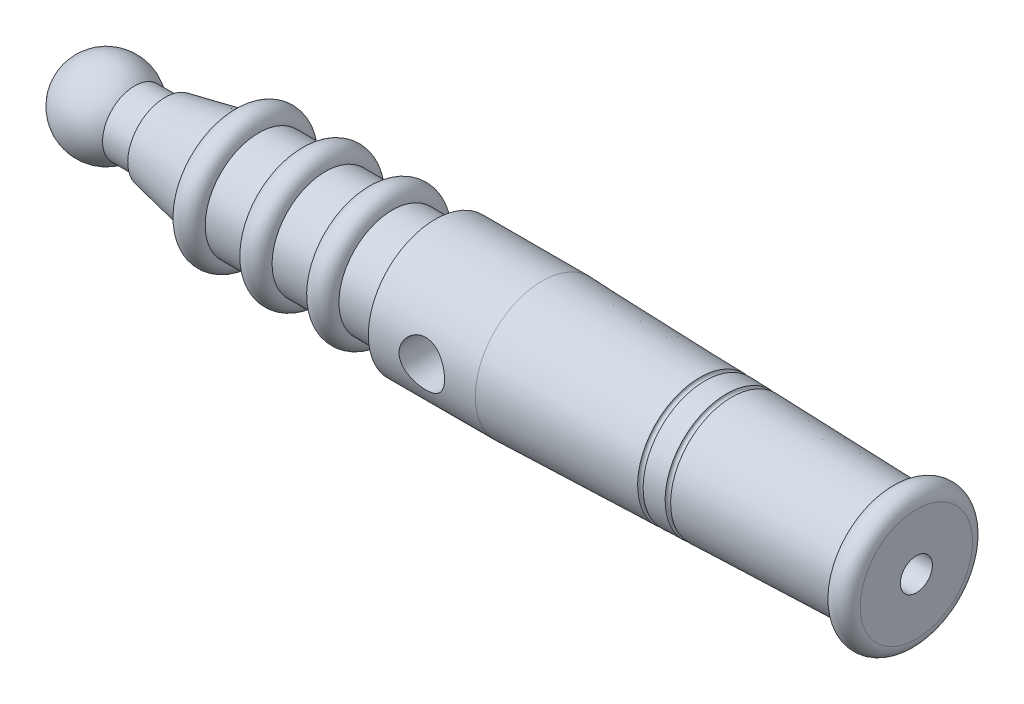
ISO-10303-21;
HEADER;
FILE_DESCRIPTION(('STEP AP214'),'2;1');
FILE_NAME('part.step','',(''),(''),'','','');
FILE_SCHEMA(('AUTOMOTIVE_DESIGN { 1 0 10303 214 1 1 1 1 }'));
ENDSEC;
DATA;
#1=APPLICATION_CONTEXT('core data for automotive mechanical design processes');
#2=APPLICATION_PROTOCOL_DEFINITION('international standard','automotive_design',2000,#1);
#3=PRODUCT_CONTEXT('',#1,'mechanical');
#4=PRODUCT('Part','Part','',(#3));
#5=PRODUCT_RELATED_PRODUCT_CATEGORY('part','',(#4));
#6=PRODUCT_DEFINITION_FORMATION('','',#4);
#7=PRODUCT_DEFINITION_CONTEXT('part definition',#1,'design');
#8=PRODUCT_DEFINITION('design','',#6,#7);
#9=PRODUCT_DEFINITION_SHAPE('','',#8);
#10=(LENGTH_UNIT() NAMED_UNIT(*) SI_UNIT(.MILLI.,.METRE.));
#11=(NAMED_UNIT(*) PLANE_ANGLE_UNIT() SI_UNIT($,.RADIAN.));
#12=(NAMED_UNIT(*) SI_UNIT($,.STERADIAN.) SOLID_ANGLE_UNIT());
#13=UNCERTAINTY_MEASURE_WITH_UNIT(LENGTH_MEASURE(1.E-05),#10,'distance_accuracy_value','');
#14=(GEOMETRIC_REPRESENTATION_CONTEXT(3) GLOBAL_UNCERTAINTY_ASSIGNED_CONTEXT((#13)) GLOBAL_UNIT_ASSIGNED_CONTEXT((#10,
#11,#12)) REPRESENTATION_CONTEXT('',''));
#15=CARTESIAN_POINT('',(0.,0.,0.));
#16=DIRECTION('',(0.,0.,1.));
#17=DIRECTION('',(1.,0.,0.));
#18=AXIS2_PLACEMENT_3D('',#15,#16,#17);
#19=CARTESIAN_POINT('',(8.,0.,0.));
#20=DIRECTION('',(-1.,0.,0.));
#21=DIRECTION('',(0.,1.,0.));
#22=AXIS2_PLACEMENT_3D('',#19,#20,#21);
#23=SPHERICAL_SURFACE('',#22,8.);
#24=CARTESIAN_POINT('',(13.2915026221292,0.,0.));
#25=DIRECTION('',(-1.,0.,0.));
#26=DIRECTION('',(0.,-1.,0.));
#27=AXIS2_PLACEMENT_3D('',#24,#25,#26);
#28=CIRCLE('',#27,6.);
#29=CARTESIAN_POINT('',(13.2915026221292,-6.,0.));
#30=VERTEX_POINT('',#29);
#31=EDGE_CURVE('E10',#30,#30,#28,.T.);
#32=ORIENTED_EDGE('',*,*,#31,.T.);
#33=EDGE_LOOP('',(#32));
#34=FACE_BOUND('',#33,.T.);
#35=ADVANCED_FACE('F35',(#34),#23,.T.);
#36=CARTESIAN_POINT('',(0.,0.,0.));
#37=DIRECTION('',(-1.,0.,0.));
#38=DIRECTION('',(0.,-1.,0.));
#39=AXIS2_PLACEMENT_3D('',#36,#37,#38);
#40=CYLINDRICAL_SURFACE('',#39,6.);
#41=ORIENTED_EDGE('',*,*,#31,.F.);
#42=EDGE_LOOP('',(#41));
#43=FACE_BOUND('',#42,.T.);
#44=CARTESIAN_POINT('',(19.,0.,0.));
#45=DIRECTION('',(-1.,0.,0.));
#46=DIRECTION('',(0.,-1.,0.));
#47=AXIS2_PLACEMENT_3D('',#44,#45,#46);
#48=CIRCLE('',#47,6.);
#49=CARTESIAN_POINT('',(19.,-6.,0.));
#50=VERTEX_POINT('',#49);
#51=EDGE_CURVE('E47',#50,#50,#48,.T.);
#52=ORIENTED_EDGE('',*,*,#51,.T.);
#53=EDGE_LOOP('',(#52));
#54=FACE_BOUND('',#53,.T.);
#55=ADVANCED_FACE('F112',(#43,#54),#40,.T.);
#56=CARTESIAN_POINT('',(19.,7.,0.));
#57=DIRECTION('',(1.,0.,0.));
#58=DIRECTION('',(0.,1.,0.));
#59=AXIS2_PLACEMENT_3D('',#56,#57,#58);
#60=PLANE('',#59);
#61=ORIENTED_EDGE('',*,*,#51,.F.);
#62=EDGE_LOOP('',(#61));
#63=FACE_BOUND('',#62,.T.);
#64=CARTESIAN_POINT('',(19.,0.,0.));
#65=DIRECTION('',(-1.,0.,0.));
#66=DIRECTION('',(0.,-1.,0.));
#67=AXIS2_PLACEMENT_3D('',#64,#65,#66);
#68=CIRCLE('',#67,7.);
#69=CARTESIAN_POINT('',(19.,-7.,0.));
#70=VERTEX_POINT('',#69);
#71=EDGE_CURVE('E52',#70,#70,#68,.T.);
#72=ORIENTED_EDGE('',*,*,#71,.T.);
#73=EDGE_LOOP('',(#72));
#74=FACE_BOUND('',#73,.T.);
#75=ADVANCED_FACE('F116',(#63,#74),#60,.F.);
#76=CARTESIAN_POINT('',(31.5485483107727,0.,0.));
#77=DIRECTION('',(1.,0.,0.));
#78=DIRECTION('',(0.,1.,0.));
#79=AXIS2_PLACEMENT_3D('',#76,#77,#78);
#80=CONICAL_SURFACE('',#79,9.50970966215454,0.197395559849881);
#81=ORIENTED_EDGE('',*,*,#71,.F.);
#82=EDGE_LOOP('',(#81));
#83=FACE_BOUND('',#82,.T.);
#84=CARTESIAN_POINT('',(31.5485483107727,0.,0.));
#85=DIRECTION('',(-1.,0.,0.));
#86=DIRECTION('',(0.,-1.,0.));
#87=AXIS2_PLACEMENT_3D('',#84,#85,#86);
#88=CIRCLE('',#87,9.50970966215454);
#89=CARTESIAN_POINT('',(31.5485483107727,-9.50970966215454,0.));
#90=VERTEX_POINT('',#89);
#91=EDGE_CURVE('E187',#90,#90,#88,.T.);
#92=ORIENTED_EDGE('',*,*,#91,.T.);
#93=EDGE_LOOP('',(#92));
#94=FACE_BOUND('',#93,.T.);
#95=ADVANCED_FACE('F121',(#83,#94),#80,.T.);
#96=CARTESIAN_POINT('',(34.,0.,0.));
#97=DIRECTION('',(-1.,0.,0.));
#98=DIRECTION('',(0.,-1.,0.));
#99=AXIS2_PLACEMENT_3D('',#96,#97,#98);
#100=TOROIDAL_SURFACE('',#99,10.,2.5);
#101=ORIENTED_EDGE('',*,*,#91,.F.);
#102=EDGE_LOOP('',(#101));
#103=FACE_BOUND('',#102,.T.);
#104=CARTESIAN_POINT('',(36.5,0.,0.));
#105=DIRECTION('',(-1.,0.,0.));
#106=DIRECTION('',(0.,-1.,0.));
#107=AXIS2_PLACEMENT_3D('',#104,#105,#106);
#108=CIRCLE('',#107,10.);
#109=CARTESIAN_POINT('',(36.5,-10.,0.));
#110=VERTEX_POINT('',#109);
#111=EDGE_CURVE('E184',#110,#110,#108,.T.);
#112=ORIENTED_EDGE('',*,*,#111,.T.);
#113=EDGE_LOOP('',(#112));
#114=FACE_BOUND('',#113,.T.);
#115=ADVANCED_FACE('F128',(#103,#114),#100,.T.);
#116=CARTESIAN_POINT('',(0.,0.,0.));
#117=DIRECTION('',(-1.,0.,0.));
#118=DIRECTION('',(0.,-1.,0.));
#119=AXIS2_PLACEMENT_3D('',#116,#117,#118);
#120=CYLINDRICAL_SURFACE('',#119,10.);
#121=ORIENTED_EDGE('',*,*,#111,.F.);
#122=EDGE_LOOP('',(#121));
#123=FACE_BOUND('',#122,.T.);
#124=CARTESIAN_POINT('',(44.,0.,0.));
#125=DIRECTION('',(-1.,0.,0.));
#126=DIRECTION('',(0.,-1.,0.));
#127=AXIS2_PLACEMENT_3D('',#124,#125,#126);
#128=CIRCLE('',#127,10.);
#129=CARTESIAN_POINT('',(44.,-10.,0.));
#130=VERTEX_POINT('',#129);
#131=EDGE_CURVE('E181',#130,#130,#128,.T.);
#132=ORIENTED_EDGE('',*,*,#131,.T.);
#133=EDGE_LOOP('',(#132));
#134=FACE_BOUND('',#133,.T.);
#135=ADVANCED_FACE('F132',(#123,#134),#120,.T.);
#136=CARTESIAN_POINT('',(46.5,0.,0.));
#137=DIRECTION('',(-1.,0.,0.));
#138=DIRECTION('',(0.,-1.,0.));
#139=AXIS2_PLACEMENT_3D('',#136,#137,#138);
#140=TOROIDAL_SURFACE('',#139,10.,2.5);
#141=ORIENTED_EDGE('',*,*,#131,.F.);
#142=EDGE_LOOP('',(#141));
#143=FACE_BOUND('',#142,.T.);
#144=CARTESIAN_POINT('',(49.,0.,0.));
#145=DIRECTION('',(-1.,0.,0.));
#146=DIRECTION('',(0.,-1.,0.));
#147=AXIS2_PLACEMENT_3D('',#144,#145,#146);
#148=CIRCLE('',#147,10.);
#149=CARTESIAN_POINT('',(49.,-10.,0.));
#150=VERTEX_POINT('',#149);
#151=EDGE_CURVE('E178',#150,#150,#148,.T.);
#152=ORIENTED_EDGE('',*,*,#151,.T.);
#153=EDGE_LOOP('',(#152));
#154=FACE_BOUND('',#153,.T.);
#155=ADVANCED_FACE('F136',(#143,#154),#140,.T.);
#156=CARTESIAN_POINT('',(0.,0.,0.));
#157=DIRECTION('',(-1.,0.,0.));
#158=DIRECTION('',(0.,-1.,0.));
#159=AXIS2_PLACEMENT_3D('',#156,#157,#158);
#160=CYLINDRICAL_SURFACE('',#159,10.);
#161=ORIENTED_EDGE('',*,*,#151,.F.);
#162=EDGE_LOOP('',(#161));
#163=FACE_BOUND('',#162,.T.);
#164=CARTESIAN_POINT('',(56.5,0.,0.));
#165=DIRECTION('',(-1.,0.,0.));
#166=DIRECTION('',(0.,-1.,0.));
#167=AXIS2_PLACEMENT_3D('',#164,#165,#166);
#168=CIRCLE('',#167,10.);
#169=CARTESIAN_POINT('',(56.5,-10.,0.));
#170=VERTEX_POINT('',#169);
#171=EDGE_CURVE('E175',#170,#170,#168,.T.);
#172=ORIENTED_EDGE('',*,*,#171,.T.);
#173=EDGE_LOOP('',(#172));
#174=FACE_BOUND('',#173,.T.);
#175=ADVANCED_FACE('F140',(#163,#174),#160,.T.);
#176=CARTESIAN_POINT('',(59.,0.,0.));
#177=DIRECTION('',(-1.,0.,0.));
#178=DIRECTION('',(0.,-1.,0.));
#179=AXIS2_PLACEMENT_3D('',#176,#177,#178);
#180=TOROIDAL_SURFACE('',#179,10.,2.5);
#181=ORIENTED_EDGE('',*,*,#171,.F.);
#182=EDGE_LOOP('',(#181));
#183=FACE_BOUND('',#182,.T.);
#184=CARTESIAN_POINT('',(61.5,0.,0.));
#185=DIRECTION('',(-1.,0.,0.));
#186=DIRECTION('',(0.,-1.,0.));
#187=AXIS2_PLACEMENT_3D('',#184,#185,#186);
#188=CIRCLE('',#187,10.);
#189=CARTESIAN_POINT('',(61.5,-10.,0.));
#190=VERTEX_POINT('',#189);
#191=EDGE_CURVE('E166',#190,#190,#188,.T.);
#192=ORIENTED_EDGE('',*,*,#191,.T.);
#193=EDGE_LOOP('',(#192));
#194=FACE_BOUND('',#193,.T.);
#195=ADVANCED_FACE('F144',(#183,#194),#180,.T.);
#196=CARTESIAN_POINT('',(0.,0.,0.));
#197=DIRECTION('',(-1.,0.,0.));
#198=DIRECTION('',(0.,-1.,0.));
#199=AXIS2_PLACEMENT_3D('',#196,#197,#198);
#200=CYLINDRICAL_SURFACE('',#199,10.);
#201=ORIENTED_EDGE('',*,*,#191,.F.);
#202=EDGE_LOOP('',(#201));
#203=FACE_BOUND('',#202,.T.);
#204=CARTESIAN_POINT('',(69.5,0.,0.));
#205=DIRECTION('',(-1.,0.,0.));
#206=DIRECTION('',(0.,-1.,0.));
#207=AXIS2_PLACEMENT_3D('',#204,#205,#206);
#208=CIRCLE('',#207,10.);
#209=CARTESIAN_POINT('',(69.5,-10.,0.));
#210=VERTEX_POINT('',#209);
#211=EDGE_CURVE('E159',#210,#210,#208,.T.);
#212=ORIENTED_EDGE('',*,*,#211,.T.);
#213=EDGE_LOOP('',(#212));
#214=FACE_BOUND('',#213,.T.);
#215=ADVANCED_FACE('F148',(#203,#214),#200,.T.);
#216=CARTESIAN_POINT('',(69.5,12.5,0.));
#217=DIRECTION('',(1.,0.,0.));
#218=DIRECTION('',(0.,1.,0.));
#219=AXIS2_PLACEMENT_3D('',#216,#217,#218);
#220=PLANE('',#219);
#221=ORIENTED_EDGE('',*,*,#211,.F.);
#222=EDGE_LOOP('',(#221));
#223=FACE_BOUND('',#222,.T.);
#224=CARTESIAN_POINT('',(69.5,0.,0.));
#225=DIRECTION('',(-1.,0.,0.));
#226=DIRECTION('',(0.,-1.,0.));
#227=AXIS2_PLACEMENT_3D('',#224,#225,#226);
#228=CIRCLE('',#227,12.5);
#229=CARTESIAN_POINT('',(69.5,-12.5,0.));
#230=VERTEX_POINT('',#229);
#231=EDGE_CURVE('E162',#230,#230,#228,.T.);
#232=ORIENTED_EDGE('',*,*,#231,.T.);
#233=EDGE_LOOP('',(#232));
#234=FACE_BOUND('',#233,.T.);
#235=ADVANCED_FACE('F107',(#223,#234),#220,.F.);
#236=CARTESIAN_POINT('',(0.,0.,0.));
#237=DIRECTION('',(-1.,0.,0.));
#238=DIRECTION('',(0.,-1.,0.));
#239=AXIS2_PLACEMENT_3D('',#236,#237,#238);
#240=CYLINDRICAL_SURFACE('',#239,12.5);
#241=CARTESIAN_POINT('',(83.75,0.,-12.5));
#242=CARTESIAN_POINT('',(83.7500020330341,0.231629316585798,-12.5000013493631));
#243=CARTESIAN_POINT('',(83.7310026670462,0.463244602260158,-12.493502868787));
#244=CARTESIAN_POINT('',(83.6557510509299,0.919637198733395,-12.4682205879803));
#245=CARTESIAN_POINT('',(83.5994964112488,1.14441406994913,-12.4494359997198));
#246=CARTESIAN_POINT('',(83.4518965380055,1.58048439723265,-12.4016188733298));
#247=CARTESIAN_POINT('',(83.360611378287,1.79180021823002,-12.3726038861914));
#248=CARTESIAN_POINT('',(83.1458184811844,2.19612038998741,-12.3072763657775));
#249=CARTESIAN_POINT('',(83.0223039931499,2.38912089291744,-12.270962304028));
#250=CARTESIAN_POINT('',(82.7419106918981,2.75825261944735,-12.1933910285169));
#251=CARTESIAN_POINT('',(82.5840824421219,2.93363688121843,-12.1520119725704));
#252=CARTESIAN_POINT('',(82.2415597009182,3.25602333800847,-12.069633438027));
#253=CARTESIAN_POINT('',(82.0568589860642,3.40301894005995,-12.0286340497037));
#254=CARTESIAN_POINT('',(81.6590227206061,3.66879190776175,-11.9503048632061));
#255=CARTESIAN_POINT('',(81.4451980705236,3.78658554363525,-11.9131228611846));
#256=CARTESIAN_POINT('',(80.9993053393739,3.98421855180599,-11.8484975327096));
#257=CARTESIAN_POINT('',(80.7672431109649,4.06407004270031,-11.8210510974587));
#258=CARTESIAN_POINT('',(80.2999754672721,4.180727158555,-11.7802904138908));
#259=CARTESIAN_POINT('',(80.0651618601511,4.21893677153849,-11.7665167255043));
#260=CARTESIAN_POINT('',(79.5920834933359,4.2556150496915,-11.7533040945085));
#261=CARTESIAN_POINT('',(79.3538198766629,4.25409658909984,-11.7538605081001));
#262=CARTESIAN_POINT('',(78.8927050541706,4.21244934024964,-11.7688435667819));
#263=CARTESIAN_POINT('',(78.6696614961546,4.1741694203804,-11.7826060062583));
#264=CARTESIAN_POINT('',(78.233374512476,4.06310816523945,-11.8213609901718));
#265=CARTESIAN_POINT('',(78.0201323083421,3.99032254229153,-11.8463549302143));
#266=CARTESIAN_POINT('',(77.6053676287839,3.81113653039608,-11.9052184288415));
#267=CARTESIAN_POINT('',(77.4040979714414,3.70419900732798,-11.9392282253861));
#268=CARTESIAN_POINT('',(77.0217829261274,3.46011773998614,-12.0122344758094));
#269=CARTESIAN_POINT('',(76.8407435911989,3.32296499140251,-12.0512324147271));
#270=CARTESIAN_POINT('',(76.493661489716,3.01353124215082,-12.1324166416207));
#271=CARTESIAN_POINT('',(76.3289723564576,2.83974395035441,-12.1746609041245));
#272=CARTESIAN_POINT('',(76.0307146722549,2.46650176991709,-12.2557250188891));
#273=CARTESIAN_POINT('',(75.897149352277,2.26704421977734,-12.294544515365));
#274=CARTESIAN_POINT('',(75.6637817200249,1.84516436753421,-12.3649312356261));
#275=CARTESIAN_POINT('',(75.5643554382243,1.62251944687187,-12.3964165316577));
#276=CARTESIAN_POINT('',(75.4047926289126,1.16233553494295,-12.4479909440337));
#277=CARTESIAN_POINT('',(75.3446418774178,0.9248019699274,-12.4680841857644));
#278=CARTESIAN_POINT('',(75.2677666520223,0.453032806948606,-12.4939206883818));
#279=CARTESIAN_POINT('',(75.2492140835185,0.219127772365221,-12.5002675966187));
#280=CARTESIAN_POINT('',(75.2508366933351,-0.248508234272232,-12.499715139365));
#281=CARTESIAN_POINT('',(75.2710050341146,-0.48223922976798,-12.4928181125577));
#282=CARTESIAN_POINT('',(75.3480582339634,-0.93548705591702,-12.4669514589193));
#283=CARTESIAN_POINT('',(75.4038095457653,-1.15521999196989,-12.4483547937561));
#284=CARTESIAN_POINT('',(75.549017457826,-1.58211571473706,-12.4013331971436));
#285=CARTESIAN_POINT('',(75.638478386259,-1.78927688332144,-12.3729070036624));
#286=CARTESIAN_POINT('',(75.8512234537794,-2.19135854363444,-12.3081499547371));
#287=CARTESIAN_POINT('',(75.975351890635,-2.38580051143911,-12.2716272117682));
#288=CARTESIAN_POINT('',(76.2529228847875,-2.75168306551547,-12.1948041286534));
#289=CARTESIAN_POINT('',(76.4063747105205,-2.92311635003781,-12.1545025961777));
#290=CARTESIAN_POINT('',(76.7468275664985,-3.24657351287905,-12.0722386132383));
#291=CARTESIAN_POINT('',(76.935073487899,-3.39729328842666,-12.0302879182072));
#292=CARTESIAN_POINT('',(77.3350778779993,-3.66518020873976,-11.9514023496921));
#293=CARTESIAN_POINT('',(77.5468367741812,-3.78234674334564,-11.914467567428));
#294=CARTESIAN_POINT('',(77.9881566802981,-3.97933669538635,-11.8501336294714));
#295=CARTESIAN_POINT('',(78.217694646285,-4.05920753889126,-11.8227223748612));
#296=CARTESIAN_POINT('',(78.6881175672848,-4.1787762904475,-11.7809981443993));
#297=CARTESIAN_POINT('',(78.9289970776366,-4.21849327320324,-11.7666789496003));
#298=CARTESIAN_POINT('',(79.4014252701727,-4.2551029021973,-11.7534862510052));
#299=CARTESIAN_POINT('',(79.632785450644,-4.2541688433069,-11.7538288765012));
#300=CARTESIAN_POINT('',(80.0918665676405,-4.21488538095235,-11.7679720866019));
#301=CARTESIAN_POINT('',(80.3195877368765,-4.17653837981658,-11.781771807111));
#302=CARTESIAN_POINT('',(80.7602486699102,-4.06508169516975,-11.8206793925214));
#303=CARTESIAN_POINT('',(80.9733961386628,-3.99270334550052,-11.8455487968498));
#304=CARTESIAN_POINT('',(81.3846811689962,-3.81583792726955,-11.9036971533386));
#305=CARTESIAN_POINT('',(81.5828153034268,-3.71134355482287,-11.9369780181425));
#306=CARTESIAN_POINT('',(81.9681337048613,-3.46772073523882,-12.0100690469571));
#307=CARTESIAN_POINT('',(82.1544218744554,-3.32724348872326,-12.0501058971147));
#308=CARTESIAN_POINT('',(82.5014819910172,-3.0178925601542,-12.1312763731794));
#309=CARTESIAN_POINT('',(82.6622465618761,-2.84901069833454,-12.1724103121393));
#310=CARTESIAN_POINT('',(82.9603796450803,-2.47930158792251,-12.2531734329683));
#311=CARTESIAN_POINT('',(83.0965125530158,-2.2774454476222,-12.2926709568964));
#312=CARTESIAN_POINT('',(83.3327805226005,-1.85239769842136,-12.3638575017702));
#313=CARTESIAN_POINT('',(83.4329230670564,-1.62921053671336,-12.3955481454238));
#314=CARTESIAN_POINT('',(83.5911995465962,-1.1749855410373,-12.4466848305204));
#315=CARTESIAN_POINT('',(83.6505523489214,-0.944413374480447,-12.4664836857426));
#316=CARTESIAN_POINT('',(83.7299455427374,-0.475887689244039,-12.4931386057906));
#317=CARTESIAN_POINT('',(83.7499979116076,-0.237936441911583,-12.4999986138946));
#318=CARTESIAN_POINT('',(83.75,0.,-12.5));
#319=B_SPLINE_CURVE_WITH_KNOTS('',3,(#241,#242,#243,#244,#245,#246,#247,#248,#249,#250,#251,
#252,#253,#254,#255,#256,#257,#258,#259,#260,#261,#262,#263,#264,#265,#266,#267,#268,#269,#270,
#271,#272,#273,#274,#275,#276,#277,#278,#279,#280,#281,#282,#283,#284,#285,#286,#287,#288,#289,
#290,#291,#292,#293,#294,#295,#296,#297,#298,#299,#300,#301,#302,#303,#304,#305,#306,#307,#308,
#309,#310,#311,#312,#313,#314,#315,#316,#317,#318),.UNSPECIFIED.,.T.,.F.,(4,2,2,2,2,2,2,2,2,2,2,
2,2,2,2,2,2,2,2,2,2,2,2,2,2,2,2,2,2,2,2,2,2,2,2,2,2,2,4),(0.,0.694012031135523,1.38806858050573,
2.08094017307814,2.77395700894338,3.48937549744916,4.2049599350972,4.94210626785766,
5.67901699996316,6.39023024980915,7.10121302747362,7.77821403353031,8.45529918574266,
9.14360628251112,9.83211877686469,10.5581272082641,11.2842109731308,12.0180534127162,
12.7516299370932,13.4522781499046,14.1528026499667,14.8320547208526,15.5113940346079,
16.2089885679879,16.9068039604599,17.6376748123879,18.368558954226,19.0985111385898,
19.8281164030437,20.5187658396099,21.2093709316938,21.8857695188882,22.5623220478608,
23.2693695244284,23.976620961389,24.7129879656022,25.4492017820333,26.1623287080454,
26.8752382644273),.UNSPECIFIED.);
#320=CARTESIAN_POINT('',(83.75,0.,-12.5));
#321=VERTEX_POINT('',#320);
#322=EDGE_CURVE('E38',#321,#321,#319,.T.);
#323=ORIENTED_EDGE('',*,*,#322,.T.);
#324=EDGE_LOOP('',(#323));
#325=FACE_BOUND('',#324,.T.);
#326=CARTESIAN_POINT('',(83.75,0.,12.5));
#327=CARTESIAN_POINT('',(83.7500020330341,-0.231629316585798,12.5000013493631));
#328=CARTESIAN_POINT('',(83.7310026670462,-0.463244602260158,12.493502868787));
#329=CARTESIAN_POINT('',(83.6557510509299,-0.919637198733395,12.4682205879803));
#330=CARTESIAN_POINT('',(83.5994964112488,-1.14441406994913,12.4494359997198));
#331=CARTESIAN_POINT('',(83.4518965380055,-1.58048439723265,12.4016188733298));
#332=CARTESIAN_POINT('',(83.360611378287,-1.79180021823002,12.3726038861914));
#333=CARTESIAN_POINT('',(83.1458184811844,-2.19612038998741,12.3072763657775));
#334=CARTESIAN_POINT('',(83.0223039931499,-2.38912089291744,12.270962304028));
#335=CARTESIAN_POINT('',(82.7419106918981,-2.75825261944735,12.1933910285169));
#336=CARTESIAN_POINT('',(82.5840824421219,-2.93363688121843,12.1520119725704));
#337=CARTESIAN_POINT('',(82.2415597009182,-3.25602333800847,12.069633438027));
#338=CARTESIAN_POINT('',(82.0568589860642,-3.40301894005995,12.0286340497037));
#339=CARTESIAN_POINT('',(81.6590227206061,-3.66879190776175,11.9503048632061));
#340=CARTESIAN_POINT('',(81.4451980705236,-3.78658554363525,11.9131228611846));
#341=CARTESIAN_POINT('',(80.9993053393739,-3.98421855180599,11.8484975327096));
#342=CARTESIAN_POINT('',(80.7672431109649,-4.06407004270031,11.8210510974587));
#343=CARTESIAN_POINT('',(80.2999754672721,-4.180727158555,11.7802904138908));
#344=CARTESIAN_POINT('',(80.0651618601511,-4.21893677153849,11.7665167255043));
#345=CARTESIAN_POINT('',(79.5920834933359,-4.2556150496915,11.7533040945085));
#346=CARTESIAN_POINT('',(79.3538198766629,-4.25409658909984,11.7538605081001));
#347=CARTESIAN_POINT('',(78.8927050541706,-4.21244934024964,11.7688435667819));
#348=CARTESIAN_POINT('',(78.6696614961546,-4.1741694203804,11.7826060062583));
#349=CARTESIAN_POINT('',(78.233374512476,-4.06310816523945,11.8213609901718));
#350=CARTESIAN_POINT('',(78.0201323083421,-3.99032254229153,11.8463549302143));
#351=CARTESIAN_POINT('',(77.6053676287839,-3.81113653039608,11.9052184288415));
#352=CARTESIAN_POINT('',(77.4040979714414,-3.70419900732798,11.9392282253861));
#353=CARTESIAN_POINT('',(77.0217829261274,-3.46011773998614,12.0122344758094));
#354=CARTESIAN_POINT('',(76.8407435911989,-3.32296499140251,12.0512324147271));
#355=CARTESIAN_POINT('',(76.493661489716,-3.01353124215082,12.1324166416207));
#356=CARTESIAN_POINT('',(76.3289723564576,-2.83974395035441,12.1746609041245));
#357=CARTESIAN_POINT('',(76.0307146722549,-2.46650176991709,12.2557250188891));
#358=CARTESIAN_POINT('',(75.897149352277,-2.26704421977734,12.294544515365));
#359=CARTESIAN_POINT('',(75.6637817200249,-1.84516436753421,12.3649312356261));
#360=CARTESIAN_POINT('',(75.5643554382243,-1.62251944687187,12.3964165316577));
#361=CARTESIAN_POINT('',(75.4047926289126,-1.16233553494295,12.4479909440337));
#362=CARTESIAN_POINT('',(75.3446418774178,-0.9248019699274,12.4680841857644));
#363=CARTESIAN_POINT('',(75.2677666520223,-0.453032806948606,12.4939206883818));
#364=CARTESIAN_POINT('',(75.2492140835185,-0.219127772365221,12.5002675966187));
#365=CARTESIAN_POINT('',(75.2508366933351,0.248508234272232,12.499715139365));
#366=CARTESIAN_POINT('',(75.2710050341146,0.48223922976798,12.4928181125577));
#367=CARTESIAN_POINT('',(75.3480582339634,0.93548705591702,12.4669514589193));
#368=CARTESIAN_POINT('',(75.4038095457653,1.15521999196989,12.4483547937561));
#369=CARTESIAN_POINT('',(75.549017457826,1.58211571473706,12.4013331971436));
#370=CARTESIAN_POINT('',(75.638478386259,1.78927688332144,12.3729070036624));
#371=CARTESIAN_POINT('',(75.8512234537794,2.19135854363444,12.3081499547371));
#372=CARTESIAN_POINT('',(75.975351890635,2.38580051143911,12.2716272117682));
#373=CARTESIAN_POINT('',(76.2529228847875,2.75168306551547,12.1948041286534));
#374=CARTESIAN_POINT('',(76.4063747105205,2.92311635003781,12.1545025961777));
#375=CARTESIAN_POINT('',(76.7468275664985,3.24657351287905,12.0722386132383));
#376=CARTESIAN_POINT('',(76.935073487899,3.39729328842666,12.0302879182072));
#377=CARTESIAN_POINT('',(77.3350778779993,3.66518020873976,11.9514023496921));
#378=CARTESIAN_POINT('',(77.5468367741812,3.78234674334564,11.914467567428));
#379=CARTESIAN_POINT('',(77.9881566802981,3.97933669538635,11.8501336294714));
#380=CARTESIAN_POINT('',(78.217694646285,4.05920753889126,11.8227223748612));
#381=CARTESIAN_POINT('',(78.6881175672848,4.1787762904475,11.7809981443993));
#382=CARTESIAN_POINT('',(78.9289970776366,4.21849327320324,11.7666789496003));
#383=CARTESIAN_POINT('',(79.4014252701727,4.2551029021973,11.7534862510052));
#384=CARTESIAN_POINT('',(79.632785450644,4.2541688433069,11.7538288765012));
#385=CARTESIAN_POINT('',(80.0918665676405,4.21488538095235,11.7679720866019));
#386=CARTESIAN_POINT('',(80.3195877368765,4.17653837981658,11.781771807111));
#387=CARTESIAN_POINT('',(80.7602486699102,4.06508169516975,11.8206793925214));
#388=CARTESIAN_POINT('',(80.9733961386628,3.99270334550052,11.8455487968498));
#389=CARTESIAN_POINT('',(81.3846811689962,3.81583792726955,11.9036971533386));
#390=CARTESIAN_POINT('',(81.5828153034268,3.71134355482287,11.9369780181425));
#391=CARTESIAN_POINT('',(81.9681337048613,3.46772073523882,12.0100690469571));
#392=CARTESIAN_POINT('',(82.1544218744554,3.32724348872326,12.0501058971147));
#393=CARTESIAN_POINT('',(82.5014819910172,3.0178925601542,12.1312763731794));
#394=CARTESIAN_POINT('',(82.6622465618761,2.84901069833454,12.1724103121393));
#395=CARTESIAN_POINT('',(82.9603796450803,2.47930158792251,12.2531734329683));
#396=CARTESIAN_POINT('',(83.0965125530158,2.2774454476222,12.2926709568964));
#397=CARTESIAN_POINT('',(83.3327805226005,1.85239769842136,12.3638575017702));
#398=CARTESIAN_POINT('',(83.4329230670564,1.62921053671336,12.3955481454238));
#399=CARTESIAN_POINT('',(83.5911995465962,1.1749855410373,12.4466848305204));
#400=CARTESIAN_POINT('',(83.6505523489214,0.944413374480447,12.4664836857426));
#401=CARTESIAN_POINT('',(83.7299455427374,0.475887689244039,12.4931386057906));
#402=CARTESIAN_POINT('',(83.7499979116076,0.237936441911583,12.4999986138946));
#403=CARTESIAN_POINT('',(83.75,0.,12.5));
#404=B_SPLINE_CURVE_WITH_KNOTS('',3,(#326,#327,#328,#329,#330,#331,#332,#333,#334,#335,#336,
#337,#338,#339,#340,#341,#342,#343,#344,#345,#346,#347,#348,#349,#350,#351,#352,#353,#354,#355,
#356,#357,#358,#359,#360,#361,#362,#363,#364,#365,#366,#367,#368,#369,#370,#371,#372,#373,#374,
#375,#376,#377,#378,#379,#380,#381,#382,#383,#384,#385,#386,#387,#388,#389,#390,#391,#392,#393,
#394,#395,#396,#397,#398,#399,#400,#401,#402,#403),.UNSPECIFIED.,.T.,.F.,(4,2,2,2,2,2,2,2,2,2,2,
2,2,2,2,2,2,2,2,2,2,2,2,2,2,2,2,2,2,2,2,2,2,2,2,2,2,2,4),(0.,0.694012031135523,1.38806858050573,
2.08094017307814,2.77395700894338,3.48937549744916,4.2049599350972,4.94210626785766,
5.67901699996316,6.39023024980915,7.10121302747362,7.77821403353031,8.45529918574266,
9.14360628251112,9.83211877686469,10.5581272082641,11.2842109731308,12.0180534127162,
12.7516299370932,13.4522781499046,14.1528026499667,14.8320547208526,15.5113940346079,
16.2089885679879,16.9068039604599,17.6376748123879,18.368558954226,19.0985111385898,
19.8281164030437,20.5187658396099,21.2093709316938,21.8857695188882,22.5623220478608,
23.2693695244284,23.976620961389,24.7129879656022,25.4492017820333,26.1623287080454,
26.8752382644273),.UNSPECIFIED.);
#405=CARTESIAN_POINT('',(83.75,0.,12.5));
#406=VERTEX_POINT('',#405);
#407=EDGE_CURVE('E55',#406,#406,#404,.T.);
#408=ORIENTED_EDGE('',*,*,#407,.T.);
#409=EDGE_LOOP('',(#408));
#410=FACE_BOUND('',#409,.T.);
#411=ORIENTED_EDGE('',*,*,#231,.F.);
#412=EDGE_LOOP('',(#411));
#413=FACE_BOUND('',#412,.T.);
#414=CARTESIAN_POINT('',(89.5,0.,0.));
#415=DIRECTION('',(-1.,0.,0.));
#416=DIRECTION('',(0.,-1.,0.));
#417=AXIS2_PLACEMENT_3D('',#414,#415,#416);
#418=CIRCLE('',#417,12.5);
#419=CARTESIAN_POINT('',(89.5,-12.5,0.));
#420=VERTEX_POINT('',#419);
#421=EDGE_CURVE('E164',#420,#420,#418,.T.);
#422=ORIENTED_EDGE('',*,*,#421,.T.);
#423=EDGE_LOOP('',(#422));
#424=FACE_BOUND('',#423,.T.);
#425=ADVANCED_FACE('F60',(#325,#410,#413,#424),#240,.T.);
#426=CARTESIAN_POINT('',(118.987274446181,0.,0.));
#427=DIRECTION('',(-1.,0.,0.));
#428=DIRECTION('',(0.,-1.,0.));
#429=AXIS2_PLACEMENT_3D('',#426,#427,#428);
#430=CONICAL_SURFACE('',#429,11.6262887837363,0.0296214444225241);
#431=ORIENTED_EDGE('',*,*,#421,.F.);
#432=EDGE_LOOP('',(#431));
#433=FACE_BOUND('',#432,.T.);
#434=CARTESIAN_POINT('',(118.987274446181,0.,0.));
#435=DIRECTION('',(-1.,0.,0.));
#436=DIRECTION('',(0.,-1.,0.));
#437=AXIS2_PLACEMENT_3D('',#434,#435,#436);
#438=CIRCLE('',#437,11.6262887837363);
#439=CARTESIAN_POINT('',(118.987274446181,-11.6262887837363,0.));
#440=VERTEX_POINT('',#439);
#441=EDGE_CURVE('E169',#440,#440,#438,.T.);
#442=ORIENTED_EDGE('',*,*,#441,.T.);
#443=EDGE_LOOP('',(#442));
#444=FACE_BOUND('',#443,.T.);
#445=ADVANCED_FACE('F100',(#433,#444),#430,.T.);
#446=CARTESIAN_POINT('',(119.486397272809,0.,0.));
#447=DIRECTION('',(-1.,0.,0.));
#448=DIRECTION('',(0.,-1.,0.));
#449=AXIS2_PLACEMENT_3D('',#446,#447,#448);
#450=TOROIDAL_SURFACE('',#449,11.5966846634354,0.500000000000002);
#451=ORIENTED_EDGE('',*,*,#441,.F.);
#452=EDGE_LOOP('',(#451));
#453=FACE_BOUND('',#452,.T.);
#454=CARTESIAN_POINT('',(119.986397272809,0.,0.));
#455=DIRECTION('',(-1.,0.,0.));
#456=DIRECTION('',(0.,-1.,0.));
#457=AXIS2_PLACEMENT_3D('',#454,#455,#456);
#458=CIRCLE('',#457,11.5966846634354);
#459=CARTESIAN_POINT('',(119.986397272809,-11.5966846634354,0.));
#460=VERTEX_POINT('',#459);
#461=EDGE_CURVE('E207',#460,#460,#458,.T.);
#462=ORIENTED_EDGE('',*,*,#461,.T.);
#463=EDGE_LOOP('',(#462));
#464=FACE_BOUND('',#463,.T.);
#465=ADVANCED_FACE('F97',(#453,#464),#450,.F.);
#466=CARTESIAN_POINT('',(123.985081031644,0.,0.));
#467=DIRECTION('',(-1.,0.,0.));
#468=DIRECTION('',(0.,-1.,0.));
#469=AXIS2_PLACEMENT_3D('',#466,#467,#468);
#470=CONICAL_SURFACE('',#469,11.478203219626,0.0296214444225239);
#471=ORIENTED_EDGE('',*,*,#461,.F.);
#472=EDGE_LOOP('',(#471));
#473=FACE_BOUND('',#472,.T.);
#474=CARTESIAN_POINT('',(123.985081031644,0.,0.));
#475=DIRECTION('',(-1.,0.,0.));
#476=DIRECTION('',(0.,-1.,0.));
#477=AXIS2_PLACEMENT_3D('',#474,#475,#476);
#478=CIRCLE('',#477,11.478203219626);
#479=CARTESIAN_POINT('',(123.985081031644,-11.478203219626,0.));
#480=VERTEX_POINT('',#479);
#481=EDGE_CURVE('E210',#480,#480,#478,.T.);
#482=ORIENTED_EDGE('',*,*,#481,.T.);
#483=EDGE_LOOP('',(#482));
#484=FACE_BOUND('',#483,.T.);
#485=ADVANCED_FACE('F93',(#473,#484),#470,.T.);
#486=CARTESIAN_POINT('',(124.484203858272,0.,0.));
#487=DIRECTION('',(-1.,0.,0.));
#488=DIRECTION('',(0.,-1.,0.));
#489=AXIS2_PLACEMENT_3D('',#486,#487,#488);
#490=TOROIDAL_SURFACE('',#489,11.4485990993251,0.500000000000002);
#491=ORIENTED_EDGE('',*,*,#481,.F.);
#492=EDGE_LOOP('',(#491));
#493=FACE_BOUND('',#492,.T.);
#494=CARTESIAN_POINT('',(124.984203858272,0.,0.));
#495=DIRECTION('',(-1.,0.,0.));
#496=DIRECTION('',(0.,-1.,0.));
#497=AXIS2_PLACEMENT_3D('',#494,#495,#496);
#498=CIRCLE('',#497,11.4485990993251);
#499=CARTESIAN_POINT('',(124.984203858272,-11.4485990993251,0.));
#500=VERTEX_POINT('',#499);
#501=EDGE_CURVE('E213',#500,#500,#498,.T.);
#502=ORIENTED_EDGE('',*,*,#501,.T.);
#503=EDGE_LOOP('',(#502));
#504=FACE_BOUND('',#503,.T.);
#505=ADVANCED_FACE('F89',(#493,#504),#490,.F.);
#506=CARTESIAN_POINT('',(154.5,0.,0.));
#507=DIRECTION('',(-1.,0.,0.));
#508=DIRECTION('',(0.,-1.,0.));
#509=AXIS2_PLACEMENT_3D('',#506,#507,#508);
#510=CONICAL_SURFACE('',#509,10.5740427820551,0.0296214444225241);
#511=ORIENTED_EDGE('',*,*,#501,.F.);
#512=EDGE_LOOP('',(#511));
#513=FACE_BOUND('',#512,.T.);
#514=CARTESIAN_POINT('',(154.5,0.,0.));
#515=DIRECTION('',(-1.,0.,0.));
#516=DIRECTION('',(0.,-1.,0.));
#517=AXIS2_PLACEMENT_3D('',#514,#515,#516);
#518=CIRCLE('',#517,10.5740427820551);
#519=CARTESIAN_POINT('',(154.5,-10.5740427820551,0.));
#520=VERTEX_POINT('',#519);
#521=EDGE_CURVE('E216',#520,#520,#518,.T.);
#522=ORIENTED_EDGE('',*,*,#521,.T.);
#523=EDGE_LOOP('',(#522));
#524=FACE_BOUND('',#523,.T.);
#525=ADVANCED_FACE('F85',(#513,#524),#510,.T.);
#526=CARTESIAN_POINT('',(156.998903292732,0.,0.));
#527=DIRECTION('',(-1.,0.,0.));
#528=DIRECTION('',(0.,-1.,0.));
#529=AXIS2_PLACEMENT_3D('',#526,#527,#528);
#530=TOROIDAL_SURFACE('',#529,10.5,2.49999999999999);
#531=ORIENTED_EDGE('',*,*,#521,.F.);
#532=EDGE_LOOP('',(#531));
#533=FACE_BOUND('',#532,.T.);
#534=CARTESIAN_POINT('',(159.498903292732,0.,0.));
#535=DIRECTION('',(-1.,0.,0.));
#536=DIRECTION('',(0.,-1.,0.));
#537=AXIS2_PLACEMENT_3D('',#534,#535,#536);
#538=CIRCLE('',#537,10.5);
#539=CARTESIAN_POINT('',(159.498903292732,-10.5,0.));
#540=VERTEX_POINT('',#539);
#541=EDGE_CURVE('E219',#540,#540,#538,.T.);
#542=ORIENTED_EDGE('',*,*,#541,.T.);
#543=EDGE_LOOP('',(#542));
#544=FACE_BOUND('',#543,.T.);
#545=ADVANCED_FACE('F81',(#533,#544),#530,.T.);
#546=CARTESIAN_POINT('',(159.498903292732,10.5,0.));
#547=DIRECTION('',(-1.,0.,0.));
#548=DIRECTION('',(0.,-1.,0.));
#549=AXIS2_PLACEMENT_3D('',#546,#547,#548);
#550=PLANE('',#549);
#551=ORIENTED_EDGE('',*,*,#541,.F.);
#552=EDGE_LOOP('',(#551));
#553=FACE_BOUND('',#552,.T.);
#554=CARTESIAN_POINT('',(159.498903292732,0.,0.));
#555=DIRECTION('',(-1.,0.,0.));
#556=DIRECTION('',(0.,-1.,0.));
#557=AXIS2_PLACEMENT_3D('',#554,#555,#556);
#558=CIRCLE('',#557,3.);
#559=CARTESIAN_POINT('',(159.498903292732,-3.,0.));
#560=VERTEX_POINT('',#559);
#561=EDGE_CURVE('E222',#560,#560,#558,.T.);
#562=ORIENTED_EDGE('',*,*,#561,.T.);
#563=EDGE_LOOP('',(#562));
#564=FACE_BOUND('',#563,.T.);
#565=ADVANCED_FACE('F77',(#553,#564),#550,.F.);
#566=CARTESIAN_POINT('',(0.,0.,0.));
#567=DIRECTION('',(-1.,0.,0.));
#568=DIRECTION('',(0.,-1.,0.));
#569=AXIS2_PLACEMENT_3D('',#566,#567,#568);
#570=CYLINDRICAL_SURFACE('',#569,3.);
#571=ORIENTED_EDGE('',*,*,#561,.F.);
#572=EDGE_LOOP('',(#571));
#573=FACE_BOUND('',#572,.T.);
#574=CARTESIAN_POINT('',(109.498903292732,0.,0.));
#575=DIRECTION('',(-1.,0.,0.));
#576=DIRECTION('',(0.,-1.,0.));
#577=AXIS2_PLACEMENT_3D('',#574,#575,#576);
#578=CIRCLE('',#577,3.);
#579=CARTESIAN_POINT('',(109.498903292732,-3.,0.));
#580=VERTEX_POINT('',#579);
#581=EDGE_CURVE('E225',#580,#580,#578,.T.);
#582=ORIENTED_EDGE('',*,*,#581,.T.);
#583=EDGE_LOOP('',(#582));
#584=FACE_BOUND('',#583,.T.);
#585=ADVANCED_FACE('F73',(#573,#584),#570,.F.);
#586=CARTESIAN_POINT('',(109.498903292732,0.,0.));
#587=DIRECTION('',(-1.,0.,0.));
#588=DIRECTION('',(0.,-1.,0.));
#589=AXIS2_PLACEMENT_3D('',#586,#587,#588);
#590=PLANE('',#589);
#591=ORIENTED_EDGE('',*,*,#581,.F.);
#592=EDGE_LOOP('',(#591));
#593=FACE_BOUND('',#592,.T.);
#594=ADVANCED_FACE('F68',(#593),#590,.F.);
#595=CARTESIAN_POINT('',(79.5,0.,-13.));
#596=DIRECTION('',(0.,0.,1.));
#597=DIRECTION('',(1.,0.,0.));
#598=AXIS2_PLACEMENT_3D('',#595,#596,#597);
#599=CYLINDRICAL_SURFACE('',#598,4.25000000000001);
#600=ORIENTED_EDGE('',*,*,#407,.F.);
#601=EDGE_LOOP('',(#600));
#602=FACE_BOUND('',#601,.T.);
#603=ORIENTED_EDGE('',*,*,#322,.F.);
#604=EDGE_LOOP('',(#603));
#605=FACE_BOUND('',#604,.T.);
#606=ADVANCED_FACE('F64',(#602,#605),#599,.F.);
#607=CLOSED_SHELL('',(#35,#55,#75,#95,#115,#135,#155,#175,#195,#215,#235,#425,#445,#465,#485,
#505,#525,#545,#565,#585,#594,#606));
#608=MANIFOLD_SOLID_BREP('B2',#607);
#609=ADVANCED_BREP_SHAPE_REPRESENTATION('',(#18,#608),#14);
#610=SHAPE_DEFINITION_REPRESENTATION(#9,#609);
ENDSEC;
END-ISO-10303-21;
